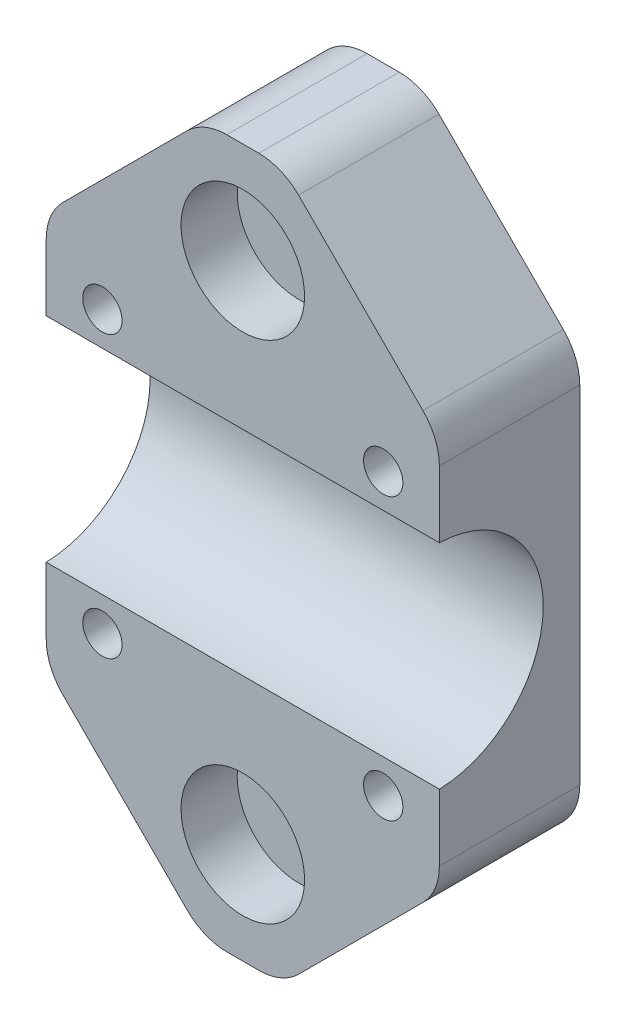
ISO-10303-21;
HEADER;
FILE_DESCRIPTION(('STEP AP214'),'2;1');
FILE_NAME('part.step','',(''),(''),'','','');
FILE_SCHEMA(('AUTOMOTIVE_DESIGN { 1 0 10303 214 1 1 1 1 }'));
ENDSEC;
DATA;
#1=APPLICATION_CONTEXT('core data for automotive mechanical design processes');
#2=APPLICATION_PROTOCOL_DEFINITION('international standard','automotive_design',2000,#1);
#3=PRODUCT_CONTEXT('',#1,'mechanical');
#4=PRODUCT('Part','Part','',(#3));
#5=PRODUCT_RELATED_PRODUCT_CATEGORY('part','',(#4));
#6=PRODUCT_DEFINITION_FORMATION('','',#4);
#7=PRODUCT_DEFINITION_CONTEXT('part definition',#1,'design');
#8=PRODUCT_DEFINITION('design','',#6,#7);
#9=PRODUCT_DEFINITION_SHAPE('','',#8);
#10=(LENGTH_UNIT() NAMED_UNIT(*) SI_UNIT(.MILLI.,.METRE.));
#11=(NAMED_UNIT(*) PLANE_ANGLE_UNIT() SI_UNIT($,.RADIAN.));
#12=(NAMED_UNIT(*) SI_UNIT($,.STERADIAN.) SOLID_ANGLE_UNIT());
#13=UNCERTAINTY_MEASURE_WITH_UNIT(LENGTH_MEASURE(1.E-05),#10,'distance_accuracy_value','');
#14=(GEOMETRIC_REPRESENTATION_CONTEXT(3) GLOBAL_UNCERTAINTY_ASSIGNED_CONTEXT((#13)) GLOBAL_UNIT_ASSIGNED_CONTEXT((#10,
#11,#12)) REPRESENTATION_CONTEXT('',''));
#15=CARTESIAN_POINT('',(0.,0.,0.));
#16=DIRECTION('',(0.,0.,1.));
#17=DIRECTION('',(1.,0.,0.));
#18=AXIS2_PLACEMENT_3D('',#15,#16,#17);
#19=CARTESIAN_POINT('',(0.,0.,12.5));
#20=DIRECTION('',(0.,0.,1.));
#21=DIRECTION('',(1.,0.,0.));
#22=AXIS2_PLACEMENT_3D('',#19,#20,#21);
#23=PLANE('',#22);
#24=CARTESIAN_POINT('',(-12.5,-12.5,12.5));
#25=DIRECTION('',(0.,0.,1.));
#26=DIRECTION('',(-1.,0.,0.));
#27=AXIS2_PLACEMENT_3D('',#24,#25,#26);
#28=CIRCLE('',#27,1.75);
#29=CARTESIAN_POINT('',(-14.25,-12.5,12.5));
#30=VERTEX_POINT('',#29);
#31=EDGE_CURVE('E526',#30,#30,#28,.T.);
#32=ORIENTED_EDGE('',*,*,#31,.F.);
#33=EDGE_LOOP('',(#32));
#34=FACE_BOUND('',#33,.T.);
#35=CARTESIAN_POINT('',(12.5,-12.5,12.5));
#36=DIRECTION('',(0.,0.,1.));
#37=DIRECTION('',(1.,0.,0.));
#38=AXIS2_PLACEMENT_3D('',#35,#36,#37);
#39=CIRCLE('',#38,1.75);
#40=CARTESIAN_POINT('',(14.25,-12.5,12.5));
#41=VERTEX_POINT('',#40);
#42=EDGE_CURVE('E525',#41,#41,#39,.T.);
#43=ORIENTED_EDGE('',*,*,#42,.F.);
#44=EDGE_LOOP('',(#43));
#45=FACE_BOUND('',#44,.T.);
#46=CARTESIAN_POINT('',(0.,-22.5,12.5));
#47=DIRECTION('',(0.,0.,1.));
#48=DIRECTION('',(-1.,0.,0.));
#49=AXIS2_PLACEMENT_3D('',#46,#47,#48);
#50=CIRCLE('',#49,5.5);
#51=CARTESIAN_POINT('',(-5.5,-22.5,12.5));
#52=VERTEX_POINT('',#51);
#53=EDGE_CURVE('E409',#52,#52,#50,.T.);
#54=ORIENTED_EDGE('',*,*,#53,.F.);
#55=EDGE_LOOP('',(#54));
#56=FACE_BOUND('',#55,.T.);
#57=DIRECTION('',(0.707106781186547,-0.707106781186547,0.));
#58=VECTOR('',#57,1.);
#59=CARTESIAN_POINT('',(-3.5,-31.5,12.5));
#60=LINE('',#59,#58);
#61=CARTESIAN_POINT('',(-16.0355339059327,-18.9644660940673,12.5));
#62=VERTEX_POINT('',#61);
#63=CARTESIAN_POINT('',(-4.96446609406727,-30.0355339059327,12.5));
#64=VERTEX_POINT('',#63);
#65=EDGE_CURVE('E168',#62,#64,#60,.T.);
#66=ORIENTED_EDGE('',*,*,#65,.T.);
#67=CARTESIAN_POINT('',(-1.42893218813453,-26.5,12.5));
#68=DIRECTION('',(0.,0.,1.));
#69=DIRECTION('',(1.,0.,0.));
#70=AXIS2_PLACEMENT_3D('',#67,#68,#69);
#71=CIRCLE('',#70,5.);
#72=CARTESIAN_POINT('',(-1.42893218813453,-31.5,12.5));
#73=VERTEX_POINT('',#72);
#74=EDGE_CURVE('E266',#64,#73,#71,.T.);
#75=ORIENTED_EDGE('',*,*,#74,.T.);
#76=DIRECTION('',(1.,0.,0.));
#77=VECTOR('',#76,1.);
#78=CARTESIAN_POINT('',(3.5,-31.5,12.5));
#79=LINE('',#78,#77);
#80=CARTESIAN_POINT('',(1.42893218813453,-31.5,12.5));
#81=VERTEX_POINT('',#80);
#82=EDGE_CURVE('E202',#73,#81,#79,.T.);
#83=ORIENTED_EDGE('',*,*,#82,.T.);
#84=CARTESIAN_POINT('',(1.42893218813453,-26.5,12.5));
#85=DIRECTION('',(0.,0.,1.));
#86=DIRECTION('',(1.,0.,0.));
#87=AXIS2_PLACEMENT_3D('',#84,#85,#86);
#88=CIRCLE('',#87,5.);
#89=CARTESIAN_POINT('',(4.96446609406726,-30.0355339059327,12.5));
#90=VERTEX_POINT('',#89);
#91=EDGE_CURVE('E264',#81,#90,#88,.T.);
#92=ORIENTED_EDGE('',*,*,#91,.T.);
#93=DIRECTION('',(0.707106781186547,0.707106781186547,0.));
#94=VECTOR('',#93,1.);
#95=CARTESIAN_POINT('',(3.5,-31.5,12.5));
#96=LINE('',#95,#94);
#97=CARTESIAN_POINT('',(16.0355339059327,-18.9644660940673,12.5));
#98=VERTEX_POINT('',#97);
#99=EDGE_CURVE('E205',#90,#98,#96,.T.);
#100=ORIENTED_EDGE('',*,*,#99,.T.);
#101=CARTESIAN_POINT('',(12.5,-15.4289321881345,12.5));
#102=DIRECTION('',(0.,0.,1.));
#103=DIRECTION('',(1.,0.,0.));
#104=AXIS2_PLACEMENT_3D('',#101,#102,#103);
#105=CIRCLE('',#104,5.);
#106=CARTESIAN_POINT('',(17.5,-15.4289321881345,12.5));
#107=VERTEX_POINT('',#106);
#108=EDGE_CURVE('E262',#98,#107,#105,.T.);
#109=ORIENTED_EDGE('',*,*,#108,.T.);
#110=DIRECTION('',(0.,1.,0.));
#111=VECTOR('',#110,1.);
#112=CARTESIAN_POINT('',(17.5,17.5,12.5));
#113=LINE('',#112,#111);
#114=CARTESIAN_POINT('',(17.5,-9.49670995661129,12.5));
#115=VERTEX_POINT('',#114);
#116=EDGE_CURVE('E209',#107,#115,#113,.T.);
#117=ORIENTED_EDGE('',*,*,#116,.T.);
#118=DIRECTION('',(1.,0.,0.));
#119=VECTOR('',#118,1.);
#120=CARTESIAN_POINT('',(-17.501,-9.49670995661129,12.5));
#121=LINE('',#120,#119);
#122=CARTESIAN_POINT('',(-17.5,-9.49670995661129,12.5));
#123=VERTEX_POINT('',#122);
#124=EDGE_CURVE('E178',#123,#115,#121,.T.);
#125=ORIENTED_EDGE('',*,*,#124,.F.);
#126=DIRECTION('',(0.,-1.,0.));
#127=VECTOR('',#126,1.);
#128=CARTESIAN_POINT('',(-17.5,17.5,12.5));
#129=LINE('',#128,#127);
#130=CARTESIAN_POINT('',(-17.5,-15.4289321881345,12.5));
#131=VERTEX_POINT('',#130);
#132=EDGE_CURVE('E169',#123,#131,#129,.T.);
#133=ORIENTED_EDGE('',*,*,#132,.T.);
#134=CARTESIAN_POINT('',(-12.5,-15.4289321881345,12.5));
#135=DIRECTION('',(0.,0.,1.));
#136=DIRECTION('',(1.,0.,0.));
#137=AXIS2_PLACEMENT_3D('',#134,#135,#136);
#138=CIRCLE('',#137,5.);
#139=EDGE_CURVE('E260',#131,#62,#138,.T.);
#140=ORIENTED_EDGE('',*,*,#139,.T.);
#141=EDGE_LOOP('',(#66,#75,#83,#92,#100,#109,#117,#125,#133,#140));
#142=FACE_BOUND('',#141,.T.);
#143=ADVANCED_FACE('F34',(#34,#45,#56,#142),#23,.T.);
#144=CARTESIAN_POINT('',(3.5,31.5,12.5));
#145=DIRECTION('',(0.,-1.,0.));
#146=DIRECTION('',(0.,0.,-1.));
#147=AXIS2_PLACEMENT_3D('',#144,#145,#146);
#148=PLANE('',#147);
#149=DIRECTION('',(-1.,0.,0.));
#150=VECTOR('',#149,1.);
#151=CARTESIAN_POINT('',(3.5,31.5,12.5));
#152=LINE('',#151,#150);
#153=CARTESIAN_POINT('',(1.42893218813453,31.5,12.5));
#154=VERTEX_POINT('',#153);
#155=CARTESIAN_POINT('',(-1.42893218813453,31.5,12.5));
#156=VERTEX_POINT('',#155);
#157=EDGE_CURVE('E194',#154,#156,#152,.T.);
#158=ORIENTED_EDGE('',*,*,#157,.F.);
#159=DIRECTION('',(0.,0.,-1.));
#160=VECTOR('',#159,1.);
#161=CARTESIAN_POINT('',(1.42893218813453,31.5,12.5));
#162=LINE('',#161,#160);
#163=CARTESIAN_POINT('',(1.42893218813453,31.5,0.));
#164=VERTEX_POINT('',#163);
#165=EDGE_CURVE('E296',#154,#164,#162,.T.);
#166=ORIENTED_EDGE('',*,*,#165,.T.);
#167=DIRECTION('',(-1.,0.,0.));
#168=VECTOR('',#167,1.);
#169=CARTESIAN_POINT('',(3.5,31.5,0.));
#170=LINE('',#169,#168);
#171=CARTESIAN_POINT('',(-1.42893218813453,31.5,0.));
#172=VERTEX_POINT('',#171);
#173=EDGE_CURVE('E192',#164,#172,#170,.T.);
#174=ORIENTED_EDGE('',*,*,#173,.T.);
#175=DIRECTION('',(0.,0.,-1.));
#176=VECTOR('',#175,1.);
#177=CARTESIAN_POINT('',(-1.42893218813453,31.5,12.5));
#178=LINE('',#177,#176);
#179=EDGE_CURVE('E294',#172,#156,#178,.F.);
#180=ORIENTED_EDGE('',*,*,#179,.T.);
#181=EDGE_LOOP('',(#158,#166,#174,#180));
#182=FACE_BOUND('',#181,.T.);
#183=ADVANCED_FACE('F302',(#182),#148,.F.);
#184=CARTESIAN_POINT('',(-3.5,31.5,12.5));
#185=DIRECTION('',(0.707106781186547,-0.707106781186547,0.));
#186=DIRECTION('',(0.707106781186547,0.707106781186548,0.));
#187=AXIS2_PLACEMENT_3D('',#184,#185,#186);
#188=PLANE('',#187);
#189=DIRECTION('',(-0.707106781186547,-0.707106781186547,0.));
#190=VECTOR('',#189,1.);
#191=CARTESIAN_POINT('',(-3.5,31.5,12.5));
#192=LINE('',#191,#190);
#193=CARTESIAN_POINT('',(-4.96446609406727,30.0355339059327,12.5));
#194=VERTEX_POINT('',#193);
#195=CARTESIAN_POINT('',(-16.0355339059327,18.9644660940673,12.5));
#196=VERTEX_POINT('',#195);
#197=EDGE_CURVE('E197',#194,#196,#192,.T.);
#198=ORIENTED_EDGE('',*,*,#197,.F.);
#199=DIRECTION('',(0.,0.,-1.));
#200=VECTOR('',#199,1.);
#201=CARTESIAN_POINT('',(-4.96446609406727,30.0355339059327,12.5));
#202=LINE('',#201,#200);
#203=CARTESIAN_POINT('',(-4.96446609406727,30.0355339059327,0.));
#204=VERTEX_POINT('',#203);
#205=EDGE_CURVE('E11',#194,#204,#202,.T.);
#206=ORIENTED_EDGE('',*,*,#205,.T.);
#207=DIRECTION('',(-0.707106781186547,-0.707106781186547,0.));
#208=VECTOR('',#207,1.);
#209=CARTESIAN_POINT('',(-3.5,31.5,0.));
#210=LINE('',#209,#208);
#211=CARTESIAN_POINT('',(-16.0355339059327,18.9644660940673,0.));
#212=VERTEX_POINT('',#211);
#213=EDGE_CURVE('E217',#204,#212,#210,.T.);
#214=ORIENTED_EDGE('',*,*,#213,.T.);
#215=DIRECTION('',(0.,0.,-1.));
#216=VECTOR('',#215,1.);
#217=CARTESIAN_POINT('',(-16.0355339059327,18.9644660940673,12.5));
#218=LINE('',#217,#216);
#219=EDGE_CURVE('E42',#212,#196,#218,.F.);
#220=ORIENTED_EDGE('',*,*,#219,.T.);
#221=EDGE_LOOP('',(#198,#206,#214,#220));
#222=FACE_BOUND('',#221,.T.);
#223=ADVANCED_FACE('F315',(#222),#188,.F.);
#224=CARTESIAN_POINT('',(-17.5,17.5,12.5));
#225=DIRECTION('',(1.,0.,0.));
#226=DIRECTION('',(0.,0.,-1.));
#227=AXIS2_PLACEMENT_3D('',#224,#225,#226);
#228=PLANE('',#227);
#229=DIRECTION('',(0.,-1.,0.));
#230=VECTOR('',#229,1.);
#231=CARTESIAN_POINT('',(-17.5,17.5,0.));
#232=LINE('',#231,#230);
#233=CARTESIAN_POINT('',(-17.5,15.4289321881345,0.));
#234=VERTEX_POINT('',#233);
#235=CARTESIAN_POINT('',(-17.5,-15.4289321881345,0.));
#236=VERTEX_POINT('',#235);
#237=EDGE_CURVE('E219',#234,#236,#232,.T.);
#238=ORIENTED_EDGE('',*,*,#237,.T.);
#239=DIRECTION('',(0.,0.,-1.));
#240=VECTOR('',#239,1.);
#241=CARTESIAN_POINT('',(-17.5,-15.4289321881345,12.5));
#242=LINE('',#241,#240);
#243=EDGE_CURVE('E292',#236,#131,#242,.F.);
#244=ORIENTED_EDGE('',*,*,#243,.T.);
#245=ORIENTED_EDGE('',*,*,#132,.F.);
#246=CARTESIAN_POINT('',(-17.5,0.,12.75));
#247=DIRECTION('',(1.,0.,0.));
#248=DIRECTION('',(0.,0.,-1.));
#249=AXIS2_PLACEMENT_3D('',#246,#247,#248);
#250=CIRCLE('',#249,9.5);
#251=CARTESIAN_POINT('',(-17.5,9.49670995661129,12.5));
#252=VERTEX_POINT('',#251);
#253=EDGE_CURVE('E174',#252,#123,#250,.F.);
#254=ORIENTED_EDGE('',*,*,#253,.F.);
#255=CARTESIAN_POINT('',(-17.5,15.4289321881345,12.5));
#256=VERTEX_POINT('',#255);
#257=EDGE_CURVE('E158',#256,#252,#129,.T.);
#258=ORIENTED_EDGE('',*,*,#257,.F.);
#259=DIRECTION('',(0.,0.,-1.));
#260=VECTOR('',#259,1.);
#261=CARTESIAN_POINT('',(-17.5,15.4289321881345,12.5));
#262=LINE('',#261,#260);
#263=EDGE_CURVE('E290',#256,#234,#262,.T.);
#264=ORIENTED_EDGE('',*,*,#263,.T.);
#265=EDGE_LOOP('',(#238,#244,#245,#254,#258,#264));
#266=FACE_BOUND('',#265,.T.);
#267=ADVANCED_FACE('F182',(#266),#228,.F.);
#268=CARTESIAN_POINT('',(-3.5,-31.5,12.5));
#269=DIRECTION('',(0.707106781186547,0.707106781186547,0.));
#270=DIRECTION('',(-0.707106781186547,0.707106781186548,0.));
#271=AXIS2_PLACEMENT_3D('',#268,#269,#270);
#272=PLANE('',#271);
#273=DIRECTION('',(0.707106781186547,-0.707106781186547,0.));
#274=VECTOR('',#273,1.);
#275=CARTESIAN_POINT('',(-3.5,-31.5,0.));
#276=LINE('',#275,#274);
#277=CARTESIAN_POINT('',(-16.0355339059327,-18.9644660940673,0.));
#278=VERTEX_POINT('',#277);
#279=CARTESIAN_POINT('',(-4.96446609406727,-30.0355339059327,0.));
#280=VERTEX_POINT('',#279);
#281=EDGE_CURVE('E221',#278,#280,#276,.T.);
#282=ORIENTED_EDGE('',*,*,#281,.T.);
#283=DIRECTION('',(0.,0.,-1.));
#284=VECTOR('',#283,1.);
#285=CARTESIAN_POINT('',(-4.96446609406727,-30.0355339059327,12.5));
#286=LINE('',#285,#284);
#287=EDGE_CURVE('E258',#280,#64,#286,.F.);
#288=ORIENTED_EDGE('',*,*,#287,.T.);
#289=ORIENTED_EDGE('',*,*,#65,.F.);
#290=DIRECTION('',(0.,0.,-1.));
#291=VECTOR('',#290,1.);
#292=CARTESIAN_POINT('',(-16.0355339059327,-18.9644660940673,12.5));
#293=LINE('',#292,#291);
#294=EDGE_CURVE('E255',#62,#278,#293,.T.);
#295=ORIENTED_EDGE('',*,*,#294,.T.);
#296=EDGE_LOOP('',(#282,#288,#289,#295));
#297=FACE_BOUND('',#296,.T.);
#298=ADVANCED_FACE('F326',(#297),#272,.F.);
#299=CARTESIAN_POINT('',(3.5,-31.5,12.5));
#300=DIRECTION('',(0.,1.,0.));
#301=DIRECTION('',(0.,0.,1.));
#302=AXIS2_PLACEMENT_3D('',#299,#300,#301);
#303=PLANE('',#302);
#304=ORIENTED_EDGE('',*,*,#82,.F.);
#305=DIRECTION('',(0.,0.,-1.));
#306=VECTOR('',#305,1.);
#307=CARTESIAN_POINT('',(-1.42893218813453,-31.5,12.5));
#308=LINE('',#307,#306);
#309=CARTESIAN_POINT('',(-1.42893218813453,-31.5,0.));
#310=VERTEX_POINT('',#309);
#311=EDGE_CURVE('E236',#73,#310,#308,.T.);
#312=ORIENTED_EDGE('',*,*,#311,.T.);
#313=DIRECTION('',(1.,0.,0.));
#314=VECTOR('',#313,1.);
#315=CARTESIAN_POINT('',(3.5,-31.5,0.));
#316=LINE('',#315,#314);
#317=CARTESIAN_POINT('',(1.42893218813453,-31.5,0.));
#318=VERTEX_POINT('',#317);
#319=EDGE_CURVE('E224',#310,#318,#316,.T.);
#320=ORIENTED_EDGE('',*,*,#319,.T.);
#321=DIRECTION('',(0.,0.,-1.));
#322=VECTOR('',#321,1.);
#323=CARTESIAN_POINT('',(1.42893218813453,-31.5,12.5));
#324=LINE('',#323,#322);
#325=EDGE_CURVE('E214',#318,#81,#324,.F.);
#326=ORIENTED_EDGE('',*,*,#325,.T.);
#327=EDGE_LOOP('',(#304,#312,#320,#326));
#328=FACE_BOUND('',#327,.T.);
#329=ADVANCED_FACE('F335',(#328),#303,.F.);
#330=CARTESIAN_POINT('',(3.5,-31.5,12.5));
#331=DIRECTION('',(-0.707106781186547,0.707106781186547,0.));
#332=DIRECTION('',(-0.707106781186547,-0.707106781186548,0.));
#333=AXIS2_PLACEMENT_3D('',#330,#331,#332);
#334=PLANE('',#333);
#335=ORIENTED_EDGE('',*,*,#99,.F.);
#336=DIRECTION('',(0.,0.,-1.));
#337=VECTOR('',#336,1.);
#338=CARTESIAN_POINT('',(4.96446609406726,-30.0355339059327,12.5));
#339=LINE('',#338,#337);
#340=CARTESIAN_POINT('',(4.96446609406726,-30.0355339059327,0.));
#341=VERTEX_POINT('',#340);
#342=EDGE_CURVE('E270',#90,#341,#339,.T.);
#343=ORIENTED_EDGE('',*,*,#342,.T.);
#344=DIRECTION('',(0.707106781186547,0.707106781186547,0.));
#345=VECTOR('',#344,1.);
#346=CARTESIAN_POINT('',(3.5,-31.5,0.));
#347=LINE('',#346,#345);
#348=CARTESIAN_POINT('',(16.0355339059327,-18.9644660940673,0.));
#349=VERTEX_POINT('',#348);
#350=EDGE_CURVE('E227',#341,#349,#347,.T.);
#351=ORIENTED_EDGE('',*,*,#350,.T.);
#352=DIRECTION('',(0.,0.,-1.));
#353=VECTOR('',#352,1.);
#354=CARTESIAN_POINT('',(16.0355339059327,-18.9644660940673,12.5));
#355=LINE('',#354,#353);
#356=EDGE_CURVE('E268',#349,#98,#355,.F.);
#357=ORIENTED_EDGE('',*,*,#356,.T.);
#358=EDGE_LOOP('',(#335,#343,#351,#357));
#359=FACE_BOUND('',#358,.T.);
#360=ADVANCED_FACE('F344',(#359),#334,.F.);
#361=CARTESIAN_POINT('',(17.5,17.5,12.5));
#362=DIRECTION('',(-1.,0.,0.));
#363=DIRECTION('',(0.,0.,1.));
#364=AXIS2_PLACEMENT_3D('',#361,#362,#363);
#365=PLANE('',#364);
#366=ORIENTED_EDGE('',*,*,#116,.F.);
#367=DIRECTION('',(0.,0.,-1.));
#368=VECTOR('',#367,1.);
#369=CARTESIAN_POINT('',(17.5,-15.4289321881345,12.5));
#370=LINE('',#369,#368);
#371=CARTESIAN_POINT('',(17.5,-15.4289321881345,0.));
#372=VERTEX_POINT('',#371);
#373=EDGE_CURVE('E275',#107,#372,#370,.T.);
#374=ORIENTED_EDGE('',*,*,#373,.T.);
#375=DIRECTION('',(0.,1.,0.));
#376=VECTOR('',#375,1.);
#377=CARTESIAN_POINT('',(17.5,17.5,0.));
#378=LINE('',#377,#376);
#379=CARTESIAN_POINT('',(17.5,15.4289321881345,0.));
#380=VERTEX_POINT('',#379);
#381=EDGE_CURVE('E230',#372,#380,#378,.T.);
#382=ORIENTED_EDGE('',*,*,#381,.T.);
#383=DIRECTION('',(0.,0.,-1.));
#384=VECTOR('',#383,1.);
#385=CARTESIAN_POINT('',(17.5,15.4289321881345,12.5));
#386=LINE('',#385,#384);
#387=CARTESIAN_POINT('',(17.5,15.4289321881345,12.5));
#388=VERTEX_POINT('',#387);
#389=EDGE_CURVE('E273',#380,#388,#386,.F.);
#390=ORIENTED_EDGE('',*,*,#389,.T.);
#391=CARTESIAN_POINT('',(17.5,9.49670995661129,12.5));
#392=VERTEX_POINT('',#391);
#393=EDGE_CURVE('E208',#392,#388,#113,.T.);
#394=ORIENTED_EDGE('',*,*,#393,.F.);
#395=CARTESIAN_POINT('',(17.5,0.,12.75));
#396=DIRECTION('',(1.,0.,0.));
#397=DIRECTION('',(0.,0.,-1.));
#398=AXIS2_PLACEMENT_3D('',#395,#396,#397);
#399=CIRCLE('',#398,9.5);
#400=EDGE_CURVE('E177',#115,#392,#399,.T.);
#401=ORIENTED_EDGE('',*,*,#400,.F.);
#402=EDGE_LOOP('',(#366,#374,#382,#390,#394,#401));
#403=FACE_BOUND('',#402,.T.);
#404=ADVANCED_FACE('F353',(#403),#365,.F.);
#405=CARTESIAN_POINT('',(3.5,31.5,12.5));
#406=DIRECTION('',(-0.707106781186547,-0.707106781186547,0.));
#407=DIRECTION('',(0.707106781186547,-0.707106781186548,0.));
#408=AXIS2_PLACEMENT_3D('',#405,#406,#407);
#409=PLANE('',#408);
#410=DIRECTION('',(-0.707106781186547,0.707106781186547,0.));
#411=VECTOR('',#410,1.);
#412=CARTESIAN_POINT('',(3.5,31.5,12.5));
#413=LINE('',#412,#411);
#414=CARTESIAN_POINT('',(16.0355339059327,18.9644660940673,12.5));
#415=VERTEX_POINT('',#414);
#416=CARTESIAN_POINT('',(4.96446609406726,30.0355339059327,12.5));
#417=VERTEX_POINT('',#416);
#418=EDGE_CURVE('E211',#415,#417,#413,.T.);
#419=ORIENTED_EDGE('',*,*,#418,.F.);
#420=DIRECTION('',(0.,0.,-1.));
#421=VECTOR('',#420,1.);
#422=CARTESIAN_POINT('',(16.0355339059327,18.9644660940673,12.5));
#423=LINE('',#422,#421);
#424=CARTESIAN_POINT('',(16.0355339059327,18.9644660940673,0.));
#425=VERTEX_POINT('',#424);
#426=EDGE_CURVE('E280',#415,#425,#423,.T.);
#427=ORIENTED_EDGE('',*,*,#426,.T.);
#428=DIRECTION('',(-0.707106781186547,0.707106781186547,0.));
#429=VECTOR('',#428,1.);
#430=CARTESIAN_POINT('',(3.5,31.5,0.));
#431=LINE('',#430,#429);
#432=CARTESIAN_POINT('',(4.96446609406726,30.0355339059327,0.));
#433=VERTEX_POINT('',#432);
#434=EDGE_CURVE('E198',#425,#433,#431,.T.);
#435=ORIENTED_EDGE('',*,*,#434,.T.);
#436=DIRECTION('',(0.,0.,-1.));
#437=VECTOR('',#436,1.);
#438=CARTESIAN_POINT('',(4.96446609406726,30.0355339059327,12.5));
#439=LINE('',#438,#437);
#440=EDGE_CURVE('E278',#433,#417,#439,.F.);
#441=ORIENTED_EDGE('',*,*,#440,.T.);
#442=EDGE_LOOP('',(#419,#427,#435,#441));
#443=FACE_BOUND('',#442,.T.);
#444=ADVANCED_FACE('F361',(#443),#409,.F.);
#445=CARTESIAN_POINT('',(12.5,12.5,12.5));
#446=DIRECTION('',(0.,0.,1.));
#447=DIRECTION('',(-1.,0.,0.));
#448=AXIS2_PLACEMENT_3D('',#445,#446,#447);
#449=CIRCLE('',#448,1.75);
#450=CARTESIAN_POINT('',(10.75,12.5,12.5));
#451=VERTEX_POINT('',#450);
#452=EDGE_CURVE('E393',#451,#451,#449,.T.);
#453=ORIENTED_EDGE('',*,*,#452,.F.);
#454=EDGE_LOOP('',(#453));
#455=FACE_BOUND('',#454,.T.);
#456=CARTESIAN_POINT('',(-12.5,12.5,12.5));
#457=DIRECTION('',(0.,0.,1.));
#458=DIRECTION('',(1.,0.,0.));
#459=AXIS2_PLACEMENT_3D('',#456,#457,#458);
#460=CIRCLE('',#459,1.75);
#461=CARTESIAN_POINT('',(-10.75,12.5,12.5));
#462=VERTEX_POINT('',#461);
#463=EDGE_CURVE('E397',#462,#462,#460,.T.);
#464=ORIENTED_EDGE('',*,*,#463,.F.);
#465=EDGE_LOOP('',(#464));
#466=FACE_BOUND('',#465,.T.);
#467=CARTESIAN_POINT('',(0.,22.5,12.5));
#468=DIRECTION('',(0.,0.,1.));
#469=DIRECTION('',(1.,0.,0.));
#470=AXIS2_PLACEMENT_3D('',#467,#468,#469);
#471=CIRCLE('',#470,5.5);
#472=CARTESIAN_POINT('',(5.5,22.5,12.5));
#473=VERTEX_POINT('',#472);
#474=EDGE_CURVE('E400',#473,#473,#471,.T.);
#475=ORIENTED_EDGE('',*,*,#474,.F.);
#476=EDGE_LOOP('',(#475));
#477=FACE_BOUND('',#476,.T.);
#478=ORIENTED_EDGE('',*,*,#393,.T.);
#479=CARTESIAN_POINT('',(12.5,15.4289321881345,12.5));
#480=DIRECTION('',(0.,0.,1.));
#481=DIRECTION('',(1.,0.,0.));
#482=AXIS2_PLACEMENT_3D('',#479,#480,#481);
#483=CIRCLE('',#482,5.);
#484=EDGE_CURVE('E288',#388,#415,#483,.T.);
#485=ORIENTED_EDGE('',*,*,#484,.T.);
#486=ORIENTED_EDGE('',*,*,#418,.T.);
#487=CARTESIAN_POINT('',(1.42893218813453,26.5,12.5));
#488=DIRECTION('',(0.,0.,1.));
#489=DIRECTION('',(1.,0.,0.));
#490=AXIS2_PLACEMENT_3D('',#487,#488,#489);
#491=CIRCLE('',#490,5.);
#492=EDGE_CURVE('E286',#417,#154,#491,.T.);
#493=ORIENTED_EDGE('',*,*,#492,.T.);
#494=ORIENTED_EDGE('',*,*,#157,.T.);
#495=CARTESIAN_POINT('',(-1.42893218813453,26.5,12.5));
#496=DIRECTION('',(0.,0.,1.));
#497=DIRECTION('',(1.,0.,0.));
#498=AXIS2_PLACEMENT_3D('',#495,#496,#497);
#499=CIRCLE('',#498,5.);
#500=EDGE_CURVE('E284',#156,#194,#499,.T.);
#501=ORIENTED_EDGE('',*,*,#500,.T.);
#502=ORIENTED_EDGE('',*,*,#197,.T.);
#503=CARTESIAN_POINT('',(-12.5,15.4289321881345,12.5));
#504=DIRECTION('',(0.,0.,1.));
#505=DIRECTION('',(1.,0.,0.));
#506=AXIS2_PLACEMENT_3D('',#503,#504,#505);
#507=CIRCLE('',#506,5.);
#508=EDGE_CURVE('E49',#196,#256,#507,.T.);
#509=ORIENTED_EDGE('',*,*,#508,.T.);
#510=ORIENTED_EDGE('',*,*,#257,.T.);
#511=DIRECTION('',(1.,0.,0.));
#512=VECTOR('',#511,1.);
#513=CARTESIAN_POINT('',(-17.501,9.49670995661129,12.5));
#514=LINE('',#513,#512);
#515=EDGE_CURVE('E162',#252,#392,#514,.T.);
#516=ORIENTED_EDGE('',*,*,#515,.T.);
#517=EDGE_LOOP('',(#478,#485,#486,#493,#494,#501,#502,#509,#510,#516));
#518=FACE_BOUND('',#517,.T.);
#519=ADVANCED_FACE('F161',(#455,#466,#477,#518),#23,.T.);
#520=CARTESIAN_POINT('',(0.,0.,0.));
#521=DIRECTION('',(0.,0.,1.));
#522=DIRECTION('',(1.,0.,0.));
#523=AXIS2_PLACEMENT_3D('',#520,#521,#522);
#524=PLANE('',#523);
#525=CARTESIAN_POINT('',(12.5,-12.5,0.));
#526=DIRECTION('',(0.,0.,-1.));
#527=DIRECTION('',(1.,0.,0.));
#528=AXIS2_PLACEMENT_3D('',#525,#526,#527);
#529=CIRCLE('',#528,3.);
#530=CARTESIAN_POINT('',(15.5,-12.5,0.));
#531=VERTEX_POINT('',#530);
#532=EDGE_CURVE('E406',#531,#531,#529,.T.);
#533=ORIENTED_EDGE('',*,*,#532,.F.);
#534=EDGE_LOOP('',(#533));
#535=FACE_BOUND('',#534,.T.);
#536=CARTESIAN_POINT('',(-12.5,-12.5,0.));
#537=DIRECTION('',(0.,0.,-1.));
#538=DIRECTION('',(-1.,0.,0.));
#539=AXIS2_PLACEMENT_3D('',#536,#537,#538);
#540=CIRCLE('',#539,3.);
#541=CARTESIAN_POINT('',(-15.5,-12.5,0.));
#542=VERTEX_POINT('',#541);
#543=EDGE_CURVE('E416',#542,#542,#540,.T.);
#544=ORIENTED_EDGE('',*,*,#543,.F.);
#545=EDGE_LOOP('',(#544));
#546=FACE_BOUND('',#545,.T.);
#547=CARTESIAN_POINT('',(-12.5,12.5,0.));
#548=DIRECTION('',(0.,0.,-1.));
#549=DIRECTION('',(1.,0.,0.));
#550=AXIS2_PLACEMENT_3D('',#547,#548,#549);
#551=CIRCLE('',#550,3.);
#552=CARTESIAN_POINT('',(-9.5,12.5,0.));
#553=VERTEX_POINT('',#552);
#554=EDGE_CURVE('E422',#553,#553,#551,.T.);
#555=ORIENTED_EDGE('',*,*,#554,.F.);
#556=EDGE_LOOP('',(#555));
#557=FACE_BOUND('',#556,.T.);
#558=CARTESIAN_POINT('',(12.5,12.5,0.));
#559=DIRECTION('',(0.,0.,-1.));
#560=DIRECTION('',(-1.,0.,0.));
#561=AXIS2_PLACEMENT_3D('',#558,#559,#560);
#562=CIRCLE('',#561,3.);
#563=CARTESIAN_POINT('',(9.5,12.5,0.));
#564=VERTEX_POINT('',#563);
#565=EDGE_CURVE('E188',#564,#564,#562,.T.);
#566=ORIENTED_EDGE('',*,*,#565,.F.);
#567=EDGE_LOOP('',(#566));
#568=FACE_BOUND('',#567,.T.);
#569=ORIENTED_EDGE('',*,*,#319,.F.);
#570=CARTESIAN_POINT('',(-1.42893218813453,-26.5,0.));
#571=DIRECTION('',(0.,0.,1.));
#572=DIRECTION('',(1.,0.,0.));
#573=AXIS2_PLACEMENT_3D('',#570,#571,#572);
#574=CIRCLE('',#573,5.);
#575=EDGE_CURVE('E253',#310,#280,#574,.F.);
#576=ORIENTED_EDGE('',*,*,#575,.T.);
#577=ORIENTED_EDGE('',*,*,#281,.F.);
#578=CARTESIAN_POINT('',(-12.5,-15.4289321881345,0.));
#579=DIRECTION('',(0.,0.,1.));
#580=DIRECTION('',(1.,0.,0.));
#581=AXIS2_PLACEMENT_3D('',#578,#579,#580);
#582=CIRCLE('',#581,5.);
#583=EDGE_CURVE('E245',#278,#236,#582,.F.);
#584=ORIENTED_EDGE('',*,*,#583,.T.);
#585=ORIENTED_EDGE('',*,*,#237,.F.);
#586=CARTESIAN_POINT('',(-12.5,15.4289321881345,0.));
#587=DIRECTION('',(0.,0.,1.));
#588=DIRECTION('',(1.,0.,0.));
#589=AXIS2_PLACEMENT_3D('',#586,#587,#588);
#590=CIRCLE('',#589,5.);
#591=EDGE_CURVE('E239',#234,#212,#590,.F.);
#592=ORIENTED_EDGE('',*,*,#591,.T.);
#593=ORIENTED_EDGE('',*,*,#213,.F.);
#594=CARTESIAN_POINT('',(-1.42893218813453,26.5,0.));
#595=DIRECTION('',(0.,0.,1.));
#596=DIRECTION('',(1.,0.,0.));
#597=AXIS2_PLACEMENT_3D('',#594,#595,#596);
#598=CIRCLE('',#597,5.);
#599=EDGE_CURVE('E241',#204,#172,#598,.F.);
#600=ORIENTED_EDGE('',*,*,#599,.T.);
#601=ORIENTED_EDGE('',*,*,#173,.F.);
#602=CARTESIAN_POINT('',(1.42893218813453,26.5,0.));
#603=DIRECTION('',(0.,0.,1.));
#604=DIRECTION('',(1.,0.,0.));
#605=AXIS2_PLACEMENT_3D('',#602,#603,#604);
#606=CIRCLE('',#605,5.);
#607=EDGE_CURVE('E243',#164,#433,#606,.F.);
#608=ORIENTED_EDGE('',*,*,#607,.T.);
#609=ORIENTED_EDGE('',*,*,#434,.F.);
#610=CARTESIAN_POINT('',(12.5,15.4289321881345,0.));
#611=DIRECTION('',(0.,0.,1.));
#612=DIRECTION('',(1.,0.,0.));
#613=AXIS2_PLACEMENT_3D('',#610,#611,#612);
#614=CIRCLE('',#613,5.);
#615=EDGE_CURVE('E247',#425,#380,#614,.F.);
#616=ORIENTED_EDGE('',*,*,#615,.T.);
#617=ORIENTED_EDGE('',*,*,#381,.F.);
#618=CARTESIAN_POINT('',(12.5,-15.4289321881345,0.));
#619=DIRECTION('',(0.,0.,1.));
#620=DIRECTION('',(1.,0.,0.));
#621=AXIS2_PLACEMENT_3D('',#618,#619,#620);
#622=CIRCLE('',#621,5.);
#623=EDGE_CURVE('E249',#372,#349,#622,.F.);
#624=ORIENTED_EDGE('',*,*,#623,.T.);
#625=ORIENTED_EDGE('',*,*,#350,.F.);
#626=CARTESIAN_POINT('',(1.42893218813453,-26.5,0.));
#627=DIRECTION('',(0.,0.,1.));
#628=DIRECTION('',(1.,0.,0.));
#629=AXIS2_PLACEMENT_3D('',#626,#627,#628);
#630=CIRCLE('',#629,5.);
#631=EDGE_CURVE('E251',#341,#318,#630,.F.);
#632=ORIENTED_EDGE('',*,*,#631,.T.);
#633=EDGE_LOOP('',(#569,#576,#577,#584,#585,#592,#593,#600,#601,#608,#609,#616,#617,#624,#625,#632));
#634=FACE_BOUND('',#633,.T.);
#635=ADVANCED_FACE('F308',(#535,#546,#557,#568,#634),#524,.F.);
#636=CARTESIAN_POINT('',(-17.501,0.,12.75));
#637=DIRECTION('',(1.,0.,0.));
#638=DIRECTION('',(0.,0.,-1.));
#639=AXIS2_PLACEMENT_3D('',#636,#637,#638);
#640=CYLINDRICAL_SURFACE('',#639,9.5);
#641=ORIENTED_EDGE('',*,*,#253,.T.);
#642=ORIENTED_EDGE('',*,*,#124,.T.);
#643=ORIENTED_EDGE('',*,*,#400,.T.);
#644=ORIENTED_EDGE('',*,*,#515,.F.);
#645=EDGE_LOOP('',(#641,#642,#643,#644));
#646=FACE_BOUND('',#645,.T.);
#647=ADVANCED_FACE('F172',(#646),#640,.F.);
#648=CARTESIAN_POINT('',(12.5,12.5,3.));
#649=DIRECTION('',(0.,0.,-1.));
#650=DIRECTION('',(-1.,0.,0.));
#651=AXIS2_PLACEMENT_3D('',#648,#649,#650);
#652=CYLINDRICAL_SURFACE('',#651,3.);
#653=CARTESIAN_POINT('',(12.5,12.5,3.));
#654=DIRECTION('',(0.,0.,-1.));
#655=DIRECTION('',(-1.,0.,0.));
#656=AXIS2_PLACEMENT_3D('',#653,#654,#655);
#657=CIRCLE('',#656,3.);
#658=CARTESIAN_POINT('',(9.5,12.5,3.));
#659=VERTEX_POINT('',#658);
#660=EDGE_CURVE('E184',#659,#659,#657,.T.);
#661=ORIENTED_EDGE('',*,*,#660,.F.);
#662=EDGE_LOOP('',(#661));
#663=FACE_BOUND('',#662,.T.);
#664=ORIENTED_EDGE('',*,*,#565,.T.);
#665=EDGE_LOOP('',(#664));
#666=FACE_BOUND('',#665,.T.);
#667=ADVANCED_FACE('F437',(#663,#666),#652,.F.);
#668=CARTESIAN_POINT('',(12.5,12.5,3.));
#669=DIRECTION('',(0.,0.,-1.));
#670=DIRECTION('',(-1.,0.,0.));
#671=AXIS2_PLACEMENT_3D('',#668,#669,#670);
#672=PLANE('',#671);
#673=ORIENTED_EDGE('',*,*,#660,.T.);
#674=EDGE_LOOP('',(#673));
#675=FACE_BOUND('',#674,.T.);
#676=ADVANCED_FACE('F439',(#675),#672,.T.);
#677=CARTESIAN_POINT('',(-12.5,12.5,3.));
#678=DIRECTION('',(0.,0.,-1.));
#679=DIRECTION('',(-1.,0.,0.));
#680=AXIS2_PLACEMENT_3D('',#677,#678,#679);
#681=CYLINDRICAL_SURFACE('',#680,3.);
#682=CARTESIAN_POINT('',(-12.5,12.5,3.));
#683=DIRECTION('',(0.,0.,-1.));
#684=DIRECTION('',(1.,0.,0.));
#685=AXIS2_PLACEMENT_3D('',#682,#683,#684);
#686=CIRCLE('',#685,3.);
#687=CARTESIAN_POINT('',(-9.5,12.5,3.));
#688=VERTEX_POINT('',#687);
#689=EDGE_CURVE('E425',#688,#688,#686,.T.);
#690=ORIENTED_EDGE('',*,*,#689,.F.);
#691=EDGE_LOOP('',(#690));
#692=FACE_BOUND('',#691,.T.);
#693=ORIENTED_EDGE('',*,*,#554,.T.);
#694=EDGE_LOOP('',(#693));
#695=FACE_BOUND('',#694,.T.);
#696=ADVANCED_FACE('F431',(#692,#695),#681,.F.);
#697=CARTESIAN_POINT('',(-12.5,12.5,3.));
#698=DIRECTION('',(0.,0.,1.));
#699=DIRECTION('',(1.,0.,0.));
#700=AXIS2_PLACEMENT_3D('',#697,#698,#699);
#701=PLANE('',#700);
#702=ORIENTED_EDGE('',*,*,#689,.T.);
#703=EDGE_LOOP('',(#702));
#704=FACE_BOUND('',#703,.T.);
#705=ADVANCED_FACE('F452',(#704),#701,.F.);
#706=CARTESIAN_POINT('',(-12.5,-12.5,3.));
#707=DIRECTION('',(0.,0.,-1.));
#708=DIRECTION('',(-1.,0.,0.));
#709=AXIS2_PLACEMENT_3D('',#706,#707,#708);
#710=CYLINDRICAL_SURFACE('',#709,3.);
#711=CARTESIAN_POINT('',(-12.5,-12.5,3.));
#712=DIRECTION('',(0.,0.,-1.));
#713=DIRECTION('',(-1.,0.,0.));
#714=AXIS2_PLACEMENT_3D('',#711,#712,#713);
#715=CIRCLE('',#714,3.);
#716=CARTESIAN_POINT('',(-15.5,-12.5,3.));
#717=VERTEX_POINT('',#716);
#718=EDGE_CURVE('E419',#717,#717,#715,.T.);
#719=ORIENTED_EDGE('',*,*,#718,.F.);
#720=EDGE_LOOP('',(#719));
#721=FACE_BOUND('',#720,.T.);
#722=ORIENTED_EDGE('',*,*,#543,.T.);
#723=EDGE_LOOP('',(#722));
#724=FACE_BOUND('',#723,.T.);
#725=ADVANCED_FACE('F456',(#721,#724),#710,.F.);
#726=CARTESIAN_POINT('',(-12.5,-12.5,3.));
#727=DIRECTION('',(0.,0.,-1.));
#728=DIRECTION('',(-1.,0.,0.));
#729=AXIS2_PLACEMENT_3D('',#726,#727,#728);
#730=PLANE('',#729);
#731=ORIENTED_EDGE('',*,*,#718,.T.);
#732=EDGE_LOOP('',(#731));
#733=FACE_BOUND('',#732,.T.);
#734=ADVANCED_FACE('F460',(#733),#730,.T.);
#735=CARTESIAN_POINT('',(12.5,-12.5,3.));
#736=DIRECTION('',(0.,0.,-1.));
#737=DIRECTION('',(-1.,0.,0.));
#738=AXIS2_PLACEMENT_3D('',#735,#736,#737);
#739=CYLINDRICAL_SURFACE('',#738,3.);
#740=CARTESIAN_POINT('',(12.5,-12.5,3.));
#741=DIRECTION('',(0.,0.,-1.));
#742=DIRECTION('',(1.,0.,0.));
#743=AXIS2_PLACEMENT_3D('',#740,#741,#742);
#744=CIRCLE('',#743,3.);
#745=CARTESIAN_POINT('',(15.5,-12.5,3.));
#746=VERTEX_POINT('',#745);
#747=EDGE_CURVE('E413',#746,#746,#744,.T.);
#748=ORIENTED_EDGE('',*,*,#747,.F.);
#749=EDGE_LOOP('',(#748));
#750=FACE_BOUND('',#749,.T.);
#751=ORIENTED_EDGE('',*,*,#532,.T.);
#752=EDGE_LOOP('',(#751));
#753=FACE_BOUND('',#752,.T.);
#754=ADVANCED_FACE('F464',(#750,#753),#739,.F.);
#755=CARTESIAN_POINT('',(12.5,-12.5,3.));
#756=DIRECTION('',(0.,0.,1.));
#757=DIRECTION('',(1.,0.,0.));
#758=AXIS2_PLACEMENT_3D('',#755,#756,#757);
#759=PLANE('',#758);
#760=ORIENTED_EDGE('',*,*,#747,.T.);
#761=EDGE_LOOP('',(#760));
#762=FACE_BOUND('',#761,.T.);
#763=ADVANCED_FACE('F468',(#762),#759,.F.);
#764=CARTESIAN_POINT('',(0.,22.5,7.5));
#765=DIRECTION('',(0.,0.,1.));
#766=DIRECTION('',(1.,0.,0.));
#767=AXIS2_PLACEMENT_3D('',#764,#765,#766);
#768=CYLINDRICAL_SURFACE('',#767,5.5);
#769=CARTESIAN_POINT('',(0.,22.5,7.5));
#770=DIRECTION('',(0.,0.,1.));
#771=DIRECTION('',(1.,0.,0.));
#772=AXIS2_PLACEMENT_3D('',#769,#770,#771);
#773=CIRCLE('',#772,5.5);
#774=CARTESIAN_POINT('',(5.5,22.5,7.5));
#775=VERTEX_POINT('',#774);
#776=EDGE_CURVE('E402',#775,#775,#773,.T.);
#777=ORIENTED_EDGE('',*,*,#776,.F.);
#778=EDGE_LOOP('',(#777));
#779=FACE_BOUND('',#778,.T.);
#780=ORIENTED_EDGE('',*,*,#474,.T.);
#781=EDGE_LOOP('',(#780));
#782=FACE_BOUND('',#781,.T.);
#783=ADVANCED_FACE('F472',(#779,#782),#768,.F.);
#784=CARTESIAN_POINT('',(0.,22.5,7.5));
#785=DIRECTION('',(0.,0.,1.));
#786=DIRECTION('',(1.,0.,0.));
#787=AXIS2_PLACEMENT_3D('',#784,#785,#786);
#788=PLANE('',#787);
#789=ORIENTED_EDGE('',*,*,#776,.T.);
#790=EDGE_LOOP('',(#789));
#791=FACE_BOUND('',#790,.T.);
#792=ADVANCED_FACE('F476',(#791),#788,.T.);
#793=CARTESIAN_POINT('',(0.,-22.5,7.5));
#794=DIRECTION('',(0.,0.,1.));
#795=DIRECTION('',(1.,0.,0.));
#796=AXIS2_PLACEMENT_3D('',#793,#794,#795);
#797=CYLINDRICAL_SURFACE('',#796,5.5);
#798=CARTESIAN_POINT('',(0.,-22.5,7.5));
#799=DIRECTION('',(0.,0.,1.));
#800=DIRECTION('',(-1.,0.,0.));
#801=AXIS2_PLACEMENT_3D('',#798,#799,#800);
#802=CIRCLE('',#801,5.5);
#803=CARTESIAN_POINT('',(-5.5,-22.5,7.5));
#804=VERTEX_POINT('',#803);
#805=EDGE_CURVE('E403',#804,#804,#802,.T.);
#806=ORIENTED_EDGE('',*,*,#805,.F.);
#807=EDGE_LOOP('',(#806));
#808=FACE_BOUND('',#807,.T.);
#809=ORIENTED_EDGE('',*,*,#53,.T.);
#810=EDGE_LOOP('',(#809));
#811=FACE_BOUND('',#810,.T.);
#812=ADVANCED_FACE('F480',(#808,#811),#797,.F.);
#813=CARTESIAN_POINT('',(0.,-22.5,7.5));
#814=DIRECTION('',(0.,0.,-1.));
#815=DIRECTION('',(-1.,0.,0.));
#816=AXIS2_PLACEMENT_3D('',#813,#814,#815);
#817=PLANE('',#816);
#818=ORIENTED_EDGE('',*,*,#805,.T.);
#819=EDGE_LOOP('',(#818));
#820=FACE_BOUND('',#819,.T.);
#821=ADVANCED_FACE('F484',(#820),#817,.F.);
#822=CARTESIAN_POINT('',(-1.42893218813453,-26.5,12.5));
#823=DIRECTION('',(0.,0.,-1.));
#824=DIRECTION('',(-1.,0.,0.));
#825=AXIS2_PLACEMENT_3D('',#822,#823,#824);
#826=CYLINDRICAL_SURFACE('',#825,5.);
#827=ORIENTED_EDGE('',*,*,#74,.F.);
#828=ORIENTED_EDGE('',*,*,#287,.F.);
#829=ORIENTED_EDGE('',*,*,#575,.F.);
#830=ORIENTED_EDGE('',*,*,#311,.F.);
#831=EDGE_LOOP('',(#827,#828,#829,#830));
#832=FACE_BOUND('',#831,.T.);
#833=ADVANCED_FACE('F333',(#832),#826,.T.);
#834=CARTESIAN_POINT('',(1.42893218813453,-26.5,12.5));
#835=DIRECTION('',(0.,0.,-1.));
#836=DIRECTION('',(-1.,0.,0.));
#837=AXIS2_PLACEMENT_3D('',#834,#835,#836);
#838=CYLINDRICAL_SURFACE('',#837,5.);
#839=ORIENTED_EDGE('',*,*,#91,.F.);
#840=ORIENTED_EDGE('',*,*,#325,.F.);
#841=ORIENTED_EDGE('',*,*,#631,.F.);
#842=ORIENTED_EDGE('',*,*,#342,.F.);
#843=EDGE_LOOP('',(#839,#840,#841,#842));
#844=FACE_BOUND('',#843,.T.);
#845=ADVANCED_FACE('F341',(#844),#838,.T.);
#846=CARTESIAN_POINT('',(12.5,-15.4289321881345,12.5));
#847=DIRECTION('',(0.,0.,-1.));
#848=DIRECTION('',(-1.,0.,0.));
#849=AXIS2_PLACEMENT_3D('',#846,#847,#848);
#850=CYLINDRICAL_SURFACE('',#849,5.);
#851=ORIENTED_EDGE('',*,*,#108,.F.);
#852=ORIENTED_EDGE('',*,*,#356,.F.);
#853=ORIENTED_EDGE('',*,*,#623,.F.);
#854=ORIENTED_EDGE('',*,*,#373,.F.);
#855=EDGE_LOOP('',(#851,#852,#853,#854));
#856=FACE_BOUND('',#855,.T.);
#857=ADVANCED_FACE('F350',(#856),#850,.T.);
#858=CARTESIAN_POINT('',(12.5,15.4289321881345,12.5));
#859=DIRECTION('',(0.,0.,-1.));
#860=DIRECTION('',(-1.,0.,0.));
#861=AXIS2_PLACEMENT_3D('',#858,#859,#860);
#862=CYLINDRICAL_SURFACE('',#861,5.);
#863=ORIENTED_EDGE('',*,*,#484,.F.);
#864=ORIENTED_EDGE('',*,*,#389,.F.);
#865=ORIENTED_EDGE('',*,*,#615,.F.);
#866=ORIENTED_EDGE('',*,*,#426,.F.);
#867=EDGE_LOOP('',(#863,#864,#865,#866));
#868=FACE_BOUND('',#867,.T.);
#869=ADVANCED_FACE('F358',(#868),#862,.T.);
#870=CARTESIAN_POINT('',(-12.5,-15.4289321881345,12.5));
#871=DIRECTION('',(0.,0.,-1.));
#872=DIRECTION('',(-1.,0.,0.));
#873=AXIS2_PLACEMENT_3D('',#870,#871,#872);
#874=CYLINDRICAL_SURFACE('',#873,5.);
#875=ORIENTED_EDGE('',*,*,#139,.F.);
#876=ORIENTED_EDGE('',*,*,#243,.F.);
#877=ORIENTED_EDGE('',*,*,#583,.F.);
#878=ORIENTED_EDGE('',*,*,#294,.F.);
#879=EDGE_LOOP('',(#875,#876,#877,#878));
#880=FACE_BOUND('',#879,.T.);
#881=ADVANCED_FACE('F323',(#880),#874,.T.);
#882=CARTESIAN_POINT('',(1.42893218813453,26.5,12.5));
#883=DIRECTION('',(0.,0.,-1.));
#884=DIRECTION('',(-1.,0.,0.));
#885=AXIS2_PLACEMENT_3D('',#882,#883,#884);
#886=CYLINDRICAL_SURFACE('',#885,5.);
#887=ORIENTED_EDGE('',*,*,#492,.F.);
#888=ORIENTED_EDGE('',*,*,#440,.F.);
#889=ORIENTED_EDGE('',*,*,#607,.F.);
#890=ORIENTED_EDGE('',*,*,#165,.F.);
#891=EDGE_LOOP('',(#887,#888,#889,#890));
#892=FACE_BOUND('',#891,.T.);
#893=ADVANCED_FACE('F363',(#892),#886,.T.);
#894=CARTESIAN_POINT('',(-1.42893218813453,26.5,12.5));
#895=DIRECTION('',(0.,0.,-1.));
#896=DIRECTION('',(-1.,0.,0.));
#897=AXIS2_PLACEMENT_3D('',#894,#895,#896);
#898=CYLINDRICAL_SURFACE('',#897,5.);
#899=ORIENTED_EDGE('',*,*,#500,.F.);
#900=ORIENTED_EDGE('',*,*,#179,.F.);
#901=ORIENTED_EDGE('',*,*,#599,.F.);
#902=ORIENTED_EDGE('',*,*,#205,.F.);
#903=EDGE_LOOP('',(#899,#900,#901,#902));
#904=FACE_BOUND('',#903,.T.);
#905=ADVANCED_FACE('F314',(#904),#898,.T.);
#906=CARTESIAN_POINT('',(-12.5,15.4289321881345,12.5));
#907=DIRECTION('',(0.,0.,-1.));
#908=DIRECTION('',(-1.,0.,0.));
#909=AXIS2_PLACEMENT_3D('',#906,#907,#908);
#910=CYLINDRICAL_SURFACE('',#909,5.);
#911=ORIENTED_EDGE('',*,*,#508,.F.);
#912=ORIENTED_EDGE('',*,*,#219,.F.);
#913=ORIENTED_EDGE('',*,*,#591,.F.);
#914=ORIENTED_EDGE('',*,*,#263,.F.);
#915=EDGE_LOOP('',(#911,#912,#913,#914));
#916=FACE_BOUND('',#915,.T.);
#917=ADVANCED_FACE('F36',(#916),#910,.T.);
#918=CARTESIAN_POINT('',(-12.5,12.5,3.4));
#919=DIRECTION('',(0.,0.,1.));
#920=DIRECTION('',(1.,0.,0.));
#921=AXIS2_PLACEMENT_3D('',#918,#919,#920);
#922=CYLINDRICAL_SURFACE('',#921,1.75);
#923=CARTESIAN_POINT('',(-12.5,12.5,3.4));
#924=DIRECTION('',(0.,0.,1.));
#925=DIRECTION('',(1.,0.,0.));
#926=AXIS2_PLACEMENT_3D('',#923,#924,#925);
#927=CIRCLE('',#926,1.75);
#928=CARTESIAN_POINT('',(-10.75,12.5,3.4));
#929=VERTEX_POINT('',#928);
#930=EDGE_CURVE('E540',#929,#929,#927,.T.);
#931=ORIENTED_EDGE('',*,*,#930,.F.);
#932=EDGE_LOOP('',(#931));
#933=FACE_BOUND('',#932,.T.);
#934=ORIENTED_EDGE('',*,*,#463,.T.);
#935=EDGE_LOOP('',(#934));
#936=FACE_BOUND('',#935,.T.);
#937=ADVANCED_FACE('F489',(#933,#936),#922,.F.);
#938=CARTESIAN_POINT('',(-12.5,12.5,3.4));
#939=DIRECTION('',(0.,0.,1.));
#940=DIRECTION('',(1.,0.,0.));
#941=AXIS2_PLACEMENT_3D('',#938,#939,#940);
#942=PLANE('',#941);
#943=ORIENTED_EDGE('',*,*,#930,.T.);
#944=EDGE_LOOP('',(#943));
#945=FACE_BOUND('',#944,.T.);
#946=ADVANCED_FACE('F492',(#945),#942,.T.);
#947=CARTESIAN_POINT('',(12.5,12.5,3.4));
#948=DIRECTION('',(0.,0.,1.));
#949=DIRECTION('',(1.,0.,0.));
#950=AXIS2_PLACEMENT_3D('',#947,#948,#949);
#951=CYLINDRICAL_SURFACE('',#950,1.75);
#952=CARTESIAN_POINT('',(12.5,12.5,3.4));
#953=DIRECTION('',(0.,0.,1.));
#954=DIRECTION('',(-1.,0.,0.));
#955=AXIS2_PLACEMENT_3D('',#952,#953,#954);
#956=CIRCLE('',#955,1.75);
#957=CARTESIAN_POINT('',(10.75,12.5,3.4));
#958=VERTEX_POINT('',#957);
#959=EDGE_CURVE('E536',#958,#958,#956,.T.);
#960=ORIENTED_EDGE('',*,*,#959,.F.);
#961=EDGE_LOOP('',(#960));
#962=FACE_BOUND('',#961,.T.);
#963=ORIENTED_EDGE('',*,*,#452,.T.);
#964=EDGE_LOOP('',(#963));
#965=FACE_BOUND('',#964,.T.);
#966=ADVANCED_FACE('F496',(#962,#965),#951,.F.);
#967=CARTESIAN_POINT('',(12.5,12.5,3.4));
#968=DIRECTION('',(0.,0.,-1.));
#969=DIRECTION('',(-1.,0.,0.));
#970=AXIS2_PLACEMENT_3D('',#967,#968,#969);
#971=PLANE('',#970);
#972=ORIENTED_EDGE('',*,*,#959,.T.);
#973=EDGE_LOOP('',(#972));
#974=FACE_BOUND('',#973,.T.);
#975=ADVANCED_FACE('F500',(#974),#971,.F.);
#976=CARTESIAN_POINT('',(12.5,-12.5,3.4));
#977=DIRECTION('',(0.,0.,1.));
#978=DIRECTION('',(1.,0.,0.));
#979=AXIS2_PLACEMENT_3D('',#976,#977,#978);
#980=CYLINDRICAL_SURFACE('',#979,1.75);
#981=CARTESIAN_POINT('',(12.5,-12.5,3.4));
#982=DIRECTION('',(0.,0.,1.));
#983=DIRECTION('',(1.,0.,0.));
#984=AXIS2_PLACEMENT_3D('',#981,#982,#983);
#985=CIRCLE('',#984,1.75);
#986=CARTESIAN_POINT('',(14.25,-12.5,3.4));
#987=VERTEX_POINT('',#986);
#988=EDGE_CURVE('E529',#987,#987,#985,.T.);
#989=ORIENTED_EDGE('',*,*,#988,.F.);
#990=EDGE_LOOP('',(#989));
#991=FACE_BOUND('',#990,.T.);
#992=ORIENTED_EDGE('',*,*,#42,.T.);
#993=EDGE_LOOP('',(#992));
#994=FACE_BOUND('',#993,.T.);
#995=ADVANCED_FACE('F504',(#991,#994),#980,.F.);
#996=CARTESIAN_POINT('',(12.5,-12.5,3.4));
#997=DIRECTION('',(0.,0.,1.));
#998=DIRECTION('',(1.,0.,0.));
#999=AXIS2_PLACEMENT_3D('',#996,#997,#998);
#1000=PLANE('',#999);
#1001=ORIENTED_EDGE('',*,*,#988,.T.);
#1002=EDGE_LOOP('',(#1001));
#1003=FACE_BOUND('',#1002,.T.);
#1004=ADVANCED_FACE('F508',(#1003),#1000,.T.);
#1005=CARTESIAN_POINT('',(-12.5,-12.5,3.4));
#1006=DIRECTION('',(0.,0.,1.));
#1007=DIRECTION('',(1.,0.,0.));
#1008=AXIS2_PLACEMENT_3D('',#1005,#1006,#1007);
#1009=CYLINDRICAL_SURFACE('',#1008,1.75);
#1010=CARTESIAN_POINT('',(-12.5,-12.5,3.4));
#1011=DIRECTION('',(0.,0.,1.));
#1012=DIRECTION('',(-1.,0.,0.));
#1013=AXIS2_PLACEMENT_3D('',#1010,#1011,#1012);
#1014=CIRCLE('',#1013,1.75);
#1015=CARTESIAN_POINT('',(-14.25,-12.5,3.4));
#1016=VERTEX_POINT('',#1015);
#1017=EDGE_CURVE('E524',#1016,#1016,#1014,.T.);
#1018=ORIENTED_EDGE('',*,*,#1017,.F.);
#1019=EDGE_LOOP('',(#1018));
#1020=FACE_BOUND('',#1019,.T.);
#1021=ORIENTED_EDGE('',*,*,#31,.T.);
#1022=EDGE_LOOP('',(#1021));
#1023=FACE_BOUND('',#1022,.T.);
#1024=ADVANCED_FACE('F512',(#1020,#1023),#1009,.F.);
#1025=CARTESIAN_POINT('',(-12.5,-12.5,3.4));
#1026=DIRECTION('',(0.,0.,-1.));
#1027=DIRECTION('',(-1.,0.,0.));
#1028=AXIS2_PLACEMENT_3D('',#1025,#1026,#1027);
#1029=PLANE('',#1028);
#1030=ORIENTED_EDGE('',*,*,#1017,.T.);
#1031=EDGE_LOOP('',(#1030));
#1032=FACE_BOUND('',#1031,.T.);
#1033=ADVANCED_FACE('F516',(#1032),#1029,.F.);
#1034=CLOSED_SHELL('',(#143,#183,#223,#267,#298,#329,#360,#404,#444,#519,#635,#647,#667,#676,
#696,#705,#725,#734,#754,#763,#783,#792,#812,#821,#833,#845,#857,#869,#881,#893,#905,#917,#937,
#946,#966,#975,#995,#1004,#1024,#1033));
#1035=MANIFOLD_SOLID_BREP('B2',#1034);
#1036=ADVANCED_BREP_SHAPE_REPRESENTATION('',(#18,#1035),#14);
#1037=SHAPE_DEFINITION_REPRESENTATION(#9,#1036);
ENDSEC;
END-ISO-10303-21;
